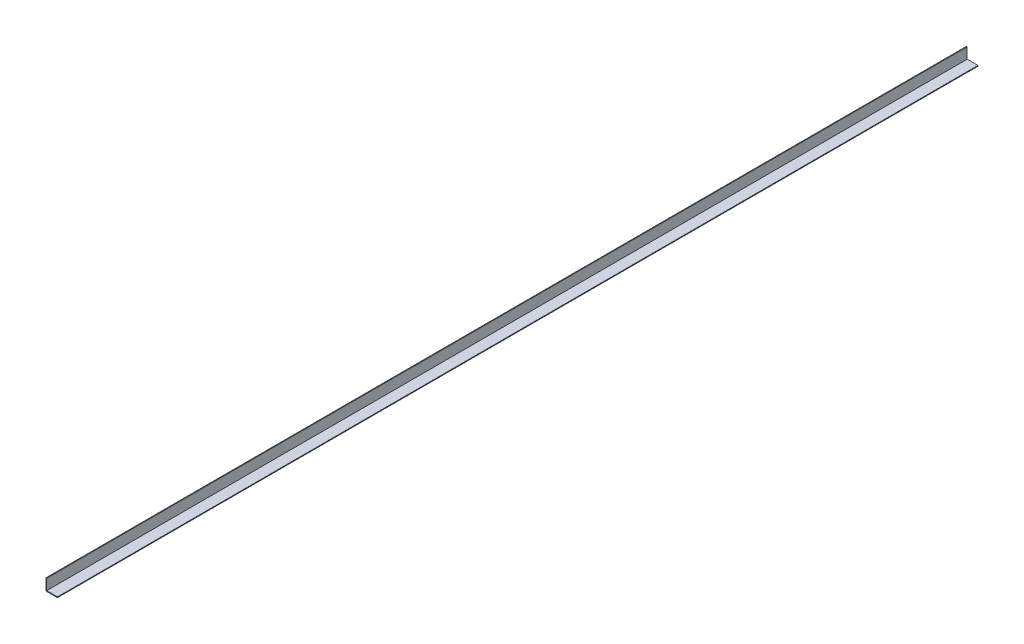
ISO-10303-21;
HEADER;
FILE_DESCRIPTION(('STEP AP214'),'2;1');
FILE_NAME('part.step','',(''),(''),'','','');
FILE_SCHEMA(('AUTOMOTIVE_DESIGN { 1 0 10303 214 1 1 1 1 }'));
ENDSEC;
DATA;
#1=APPLICATION_CONTEXT('core data for automotive mechanical design processes');
#2=APPLICATION_PROTOCOL_DEFINITION('international standard','automotive_design',2000,#1);
#3=PRODUCT_CONTEXT('',#1,'mechanical');
#4=PRODUCT('Part','Part','',(#3));
#5=PRODUCT_RELATED_PRODUCT_CATEGORY('part','',(#4));
#6=PRODUCT_DEFINITION_FORMATION('','',#4);
#7=PRODUCT_DEFINITION_CONTEXT('part definition',#1,'design');
#8=PRODUCT_DEFINITION('design','',#6,#7);
#9=PRODUCT_DEFINITION_SHAPE('','',#8);
#10=(LENGTH_UNIT() NAMED_UNIT(*) SI_UNIT(.MILLI.,.METRE.));
#11=(NAMED_UNIT(*) PLANE_ANGLE_UNIT() SI_UNIT($,.RADIAN.));
#12=(NAMED_UNIT(*) SI_UNIT($,.STERADIAN.) SOLID_ANGLE_UNIT());
#13=UNCERTAINTY_MEASURE_WITH_UNIT(LENGTH_MEASURE(1.E-05),#10,'distance_accuracy_value','');
#14=(GEOMETRIC_REPRESENTATION_CONTEXT(3) GLOBAL_UNCERTAINTY_ASSIGNED_CONTEXT((#13)) GLOBAL_UNIT_ASSIGNED_CONTEXT((#10,
#11,#12)) REPRESENTATION_CONTEXT('',''));
#15=CARTESIAN_POINT('',(0.,0.,0.));
#16=DIRECTION('',(0.,0.,1.));
#17=DIRECTION('',(1.,0.,0.));
#18=AXIS2_PLACEMENT_3D('',#15,#16,#17);
#19=CARTESIAN_POINT('',(4.76,76.2,-6100.));
#20=DIRECTION('',(0.,1.,0.));
#21=DIRECTION('',(0.,0.,1.));
#22=AXIS2_PLACEMENT_3D('',#19,#20,#21);
#23=PLANE('',#22);
#24=DIRECTION('',(-1.,0.,0.));
#25=VECTOR('',#24,1.);
#26=CARTESIAN_POINT('',(4.76,76.2,0.));
#27=LINE('',#26,#25);
#28=CARTESIAN_POINT('',(4.76,76.2,0.));
#29=VERTEX_POINT('',#28);
#30=CARTESIAN_POINT('',(0.,76.2,0.));
#31=VERTEX_POINT('',#30);
#32=EDGE_CURVE('E118',#29,#31,#27,.T.);
#33=ORIENTED_EDGE('',*,*,#32,.F.);
#34=DIRECTION('',(0.,0.,1.));
#35=VECTOR('',#34,1.);
#36=CARTESIAN_POINT('',(4.76,76.2,-6100.));
#37=LINE('',#36,#35);
#38=CARTESIAN_POINT('',(4.76,76.2,-6100.));
#39=VERTEX_POINT('',#38);
#40=EDGE_CURVE('E11',#39,#29,#37,.T.);
#41=ORIENTED_EDGE('',*,*,#40,.F.);
#42=DIRECTION('',(-1.,0.,0.));
#43=VECTOR('',#42,1.);
#44=CARTESIAN_POINT('',(4.76,76.2,-6100.));
#45=LINE('',#44,#43);
#46=CARTESIAN_POINT('',(0.,76.2,-6100.));
#47=VERTEX_POINT('',#46);
#48=EDGE_CURVE('E132',#39,#47,#45,.T.);
#49=ORIENTED_EDGE('',*,*,#48,.T.);
#50=DIRECTION('',(0.,0.,1.));
#51=VECTOR('',#50,1.);
#52=CARTESIAN_POINT('',(0.,76.2,-6100.));
#53=LINE('',#52,#51);
#54=EDGE_CURVE('E36',#47,#31,#53,.T.);
#55=ORIENTED_EDGE('',*,*,#54,.T.);
#56=EDGE_LOOP('',(#33,#41,#49,#55));
#57=FACE_BOUND('',#56,.T.);
#58=ADVANCED_FACE('F33',(#57),#23,.T.);
#59=CARTESIAN_POINT('',(4.76,4.76,-6100.));
#60=DIRECTION('',(1.,0.,0.));
#61=DIRECTION('',(0.,1.,0.));
#62=AXIS2_PLACEMENT_3D('',#59,#60,#61);
#63=PLANE('',#62);
#64=DIRECTION('',(0.,1.,0.));
#65=VECTOR('',#64,1.);
#66=CARTESIAN_POINT('',(4.76,4.76,0.));
#67=LINE('',#66,#65);
#68=CARTESIAN_POINT('',(4.76,4.76,0.));
#69=VERTEX_POINT('',#68);
#70=EDGE_CURVE('E130',#69,#29,#67,.T.);
#71=ORIENTED_EDGE('',*,*,#70,.F.);
#72=DIRECTION('',(0.,0.,1.));
#73=VECTOR('',#72,1.);
#74=CARTESIAN_POINT('',(4.76,4.76,-6100.));
#75=LINE('',#74,#73);
#76=CARTESIAN_POINT('',(4.76,4.76,-6100.));
#77=VERTEX_POINT('',#76);
#78=EDGE_CURVE('E42',#77,#69,#75,.T.);
#79=ORIENTED_EDGE('',*,*,#78,.F.);
#80=DIRECTION('',(0.,1.,0.));
#81=VECTOR('',#80,1.);
#82=CARTESIAN_POINT('',(4.76,4.76,-6100.));
#83=LINE('',#82,#81);
#84=EDGE_CURVE('E108',#77,#39,#83,.T.);
#85=ORIENTED_EDGE('',*,*,#84,.T.);
#86=ORIENTED_EDGE('',*,*,#40,.T.);
#87=EDGE_LOOP('',(#71,#79,#85,#86));
#88=FACE_BOUND('',#87,.T.);
#89=ADVANCED_FACE('F140',(#88),#63,.T.);
#90=CARTESIAN_POINT('',(76.2,4.76,-6100.));
#91=DIRECTION('',(0.,1.,0.));
#92=DIRECTION('',(-1.,0.,0.));
#93=AXIS2_PLACEMENT_3D('',#90,#91,#92);
#94=PLANE('',#93);
#95=DIRECTION('',(-1.,0.,0.));
#96=VECTOR('',#95,1.);
#97=CARTESIAN_POINT('',(76.2,4.76,0.));
#98=LINE('',#97,#96);
#99=CARTESIAN_POINT('',(76.2,4.76,0.));
#100=VERTEX_POINT('',#99);
#101=EDGE_CURVE('E95',#100,#69,#98,.T.);
#102=ORIENTED_EDGE('',*,*,#101,.F.);
#103=DIRECTION('',(0.,0.,1.));
#104=VECTOR('',#103,1.);
#105=CARTESIAN_POINT('',(76.2,4.76,-6100.));
#106=LINE('',#105,#104);
#107=CARTESIAN_POINT('',(76.2,4.76,-6100.));
#108=VERTEX_POINT('',#107);
#109=EDGE_CURVE('E90',#108,#100,#106,.T.);
#110=ORIENTED_EDGE('',*,*,#109,.F.);
#111=DIRECTION('',(-1.,0.,0.));
#112=VECTOR('',#111,1.);
#113=CARTESIAN_POINT('',(76.2,4.76,-6100.));
#114=LINE('',#113,#112);
#115=EDGE_CURVE('E93',#108,#77,#114,.T.);
#116=ORIENTED_EDGE('',*,*,#115,.T.);
#117=ORIENTED_EDGE('',*,*,#78,.T.);
#118=EDGE_LOOP('',(#102,#110,#116,#117));
#119=FACE_BOUND('',#118,.T.);
#120=ADVANCED_FACE('F92',(#119),#94,.T.);
#121=CARTESIAN_POINT('',(76.2,0.,-6100.));
#122=DIRECTION('',(1.,0.,0.));
#123=DIRECTION('',(0.,0.,-1.));
#124=AXIS2_PLACEMENT_3D('',#121,#122,#123);
#125=PLANE('',#124);
#126=DIRECTION('',(0.,1.,0.));
#127=VECTOR('',#126,1.);
#128=CARTESIAN_POINT('',(76.2,0.,0.));
#129=LINE('',#128,#127);
#130=CARTESIAN_POINT('',(76.2,0.,0.));
#131=VERTEX_POINT('',#130);
#132=EDGE_CURVE('E127',#131,#100,#129,.T.);
#133=ORIENTED_EDGE('',*,*,#132,.F.);
#134=DIRECTION('',(0.,0.,1.));
#135=VECTOR('',#134,1.);
#136=CARTESIAN_POINT('',(76.2,0.,-6100.));
#137=LINE('',#136,#135);
#138=CARTESIAN_POINT('',(76.2,0.,-6100.));
#139=VERTEX_POINT('',#138);
#140=EDGE_CURVE('E100',#139,#131,#137,.T.);
#141=ORIENTED_EDGE('',*,*,#140,.F.);
#142=DIRECTION('',(0.,1.,0.));
#143=VECTOR('',#142,1.);
#144=CARTESIAN_POINT('',(76.2,0.,-6100.));
#145=LINE('',#144,#143);
#146=EDGE_CURVE('E106',#139,#108,#145,.T.);
#147=ORIENTED_EDGE('',*,*,#146,.T.);
#148=ORIENTED_EDGE('',*,*,#109,.T.);
#149=EDGE_LOOP('',(#133,#141,#147,#148));
#150=FACE_BOUND('',#149,.T.);
#151=ADVANCED_FACE('F110',(#150),#125,.T.);
#152=CARTESIAN_POINT('',(0.,0.,-6100.));
#153=DIRECTION('',(0.,-1.,0.));
#154=DIRECTION('',(0.,0.,-1.));
#155=AXIS2_PLACEMENT_3D('',#152,#153,#154);
#156=PLANE('',#155);
#157=DIRECTION('',(1.,0.,0.));
#158=VECTOR('',#157,1.);
#159=CARTESIAN_POINT('',(0.,0.,0.));
#160=LINE('',#159,#158);
#161=CARTESIAN_POINT('',(0.,0.,0.));
#162=VERTEX_POINT('',#161);
#163=EDGE_CURVE('E124',#162,#131,#160,.T.);
#164=ORIENTED_EDGE('',*,*,#163,.F.);
#165=DIRECTION('',(0.,0.,1.));
#166=VECTOR('',#165,1.);
#167=CARTESIAN_POINT('',(0.,0.,-6100.));
#168=LINE('',#167,#166);
#169=CARTESIAN_POINT('',(0.,0.,-6100.));
#170=VERTEX_POINT('',#169);
#171=EDGE_CURVE('E135',#170,#162,#168,.T.);
#172=ORIENTED_EDGE('',*,*,#171,.F.);
#173=DIRECTION('',(1.,0.,0.));
#174=VECTOR('',#173,1.);
#175=CARTESIAN_POINT('',(0.,0.,-6100.));
#176=LINE('',#175,#174);
#177=EDGE_CURVE('E111',#170,#139,#176,.T.);
#178=ORIENTED_EDGE('',*,*,#177,.T.);
#179=ORIENTED_EDGE('',*,*,#140,.T.);
#180=EDGE_LOOP('',(#164,#172,#178,#179));
#181=FACE_BOUND('',#180,.T.);
#182=ADVANCED_FACE('F153',(#181),#156,.T.);
#183=CARTESIAN_POINT('',(0.,76.2,-6100.));
#184=DIRECTION('',(-1.,0.,0.));
#185=DIRECTION('',(0.,-1.,0.));
#186=AXIS2_PLACEMENT_3D('',#183,#184,#185);
#187=PLANE('',#186);
#188=DIRECTION('',(0.,-1.,0.));
#189=VECTOR('',#188,1.);
#190=CARTESIAN_POINT('',(0.,76.2,0.));
#191=LINE('',#190,#189);
#192=EDGE_CURVE('E121',#31,#162,#191,.T.);
#193=ORIENTED_EDGE('',*,*,#192,.F.);
#194=ORIENTED_EDGE('',*,*,#54,.F.);
#195=DIRECTION('',(0.,-1.,0.));
#196=VECTOR('',#195,1.);
#197=CARTESIAN_POINT('',(0.,76.2,-6100.));
#198=LINE('',#197,#196);
#199=EDGE_CURVE('E113',#47,#170,#198,.T.);
#200=ORIENTED_EDGE('',*,*,#199,.T.);
#201=ORIENTED_EDGE('',*,*,#171,.T.);
#202=EDGE_LOOP('',(#193,#194,#200,#201));
#203=FACE_BOUND('',#202,.T.);
#204=ADVANCED_FACE('F137',(#203),#187,.T.);
#205=CARTESIAN_POINT('',(0.,0.,-6100.));
#206=DIRECTION('',(0.,0.,1.));
#207=DIRECTION('',(1.,0.,0.));
#208=AXIS2_PLACEMENT_3D('',#205,#206,#207);
#209=PLANE('',#208);
#210=ORIENTED_EDGE('',*,*,#48,.F.);
#211=ORIENTED_EDGE('',*,*,#84,.F.);
#212=ORIENTED_EDGE('',*,*,#115,.F.);
#213=ORIENTED_EDGE('',*,*,#146,.F.);
#214=ORIENTED_EDGE('',*,*,#177,.F.);
#215=ORIENTED_EDGE('',*,*,#199,.F.);
#216=EDGE_LOOP('',(#210,#211,#212,#213,#214,#215));
#217=FACE_BOUND('',#216,.T.);
#218=ADVANCED_FACE('F104',(#217),#209,.F.);
#219=CARTESIAN_POINT('',(0.,0.,0.));
#220=DIRECTION('',(0.,0.,1.));
#221=DIRECTION('',(1.,0.,0.));
#222=AXIS2_PLACEMENT_3D('',#219,#220,#221);
#223=PLANE('',#222);
#224=ORIENTED_EDGE('',*,*,#32,.T.);
#225=ORIENTED_EDGE('',*,*,#192,.T.);
#226=ORIENTED_EDGE('',*,*,#163,.T.);
#227=ORIENTED_EDGE('',*,*,#132,.T.);
#228=ORIENTED_EDGE('',*,*,#101,.T.);
#229=ORIENTED_EDGE('',*,*,#70,.T.);
#230=EDGE_LOOP('',(#224,#225,#226,#227,#228,#229));
#231=FACE_BOUND('',#230,.T.);
#232=ADVANCED_FACE('F139',(#231),#223,.T.);
#233=CLOSED_SHELL('',(#58,#89,#120,#151,#182,#204,#218,#232));
#234=MANIFOLD_SOLID_BREP('B2',#233);
#235=ADVANCED_BREP_SHAPE_REPRESENTATION('',(#18,#234),#14);
#236=SHAPE_DEFINITION_REPRESENTATION(#9,#235);
ENDSEC;
END-ISO-10303-21;
